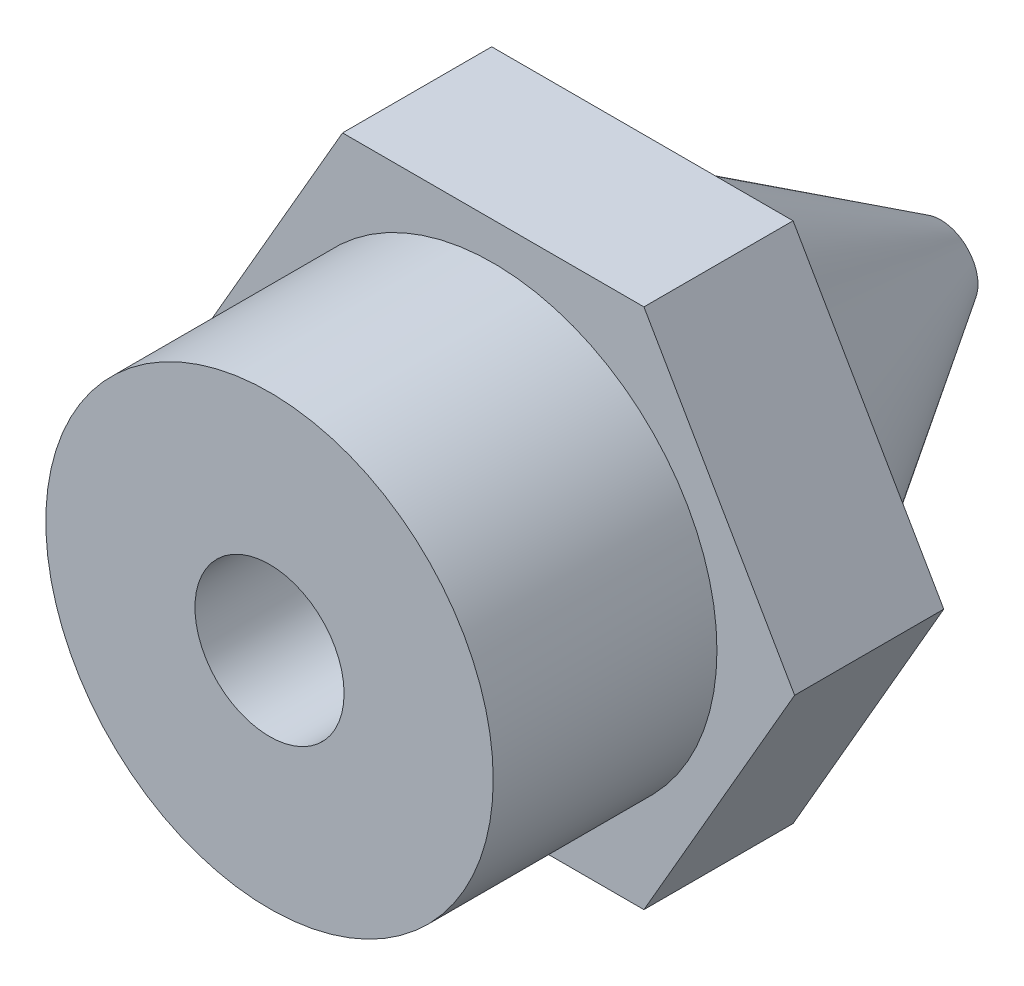
ISO-10303-21;
HEADER;
FILE_DESCRIPTION(('STEP AP214'),'2;1');
FILE_NAME('part.step','',(''),(''),'','','');
FILE_SCHEMA(('AUTOMOTIVE_DESIGN { 1 0 10303 214 1 1 1 1 }'));
ENDSEC;
DATA;
#1=APPLICATION_CONTEXT('core data for automotive mechanical design processes');
#2=APPLICATION_PROTOCOL_DEFINITION('international standard','automotive_design',2000,#1);
#3=PRODUCT_CONTEXT('',#1,'mechanical');
#4=PRODUCT('Part','Part','',(#3));
#5=PRODUCT_RELATED_PRODUCT_CATEGORY('part','',(#4));
#6=PRODUCT_DEFINITION_FORMATION('','',#4);
#7=PRODUCT_DEFINITION_CONTEXT('part definition',#1,'design');
#8=PRODUCT_DEFINITION('design','',#6,#7);
#9=PRODUCT_DEFINITION_SHAPE('','',#8);
#10=(LENGTH_UNIT() NAMED_UNIT(*) SI_UNIT(.MILLI.,.METRE.));
#11=(NAMED_UNIT(*) PLANE_ANGLE_UNIT() SI_UNIT($,.RADIAN.));
#12=(NAMED_UNIT(*) SI_UNIT($,.STERADIAN.) SOLID_ANGLE_UNIT());
#13=UNCERTAINTY_MEASURE_WITH_UNIT(LENGTH_MEASURE(1.E-05),#10,'distance_accuracy_value','');
#14=(GEOMETRIC_REPRESENTATION_CONTEXT(3) GLOBAL_UNCERTAINTY_ASSIGNED_CONTEXT((#13)) GLOBAL_UNIT_ASSIGNED_CONTEXT((#10,
#11,#12)) REPRESENTATION_CONTEXT('',''));
#15=CARTESIAN_POINT('',(0.,0.,0.));
#16=DIRECTION('',(0.,0.,1.));
#17=DIRECTION('',(1.,0.,0.));
#18=AXIS2_PLACEMENT_3D('',#15,#16,#17);
#19=CARTESIAN_POINT('',(2.02072594216368,3.50000000000001,9.));
#20=DIRECTION('',(0.,-1.,0.));
#21=DIRECTION('',(1.,0.,0.));
#22=AXIS2_PLACEMENT_3D('',#19,#20,#21);
#23=PLANE('',#22);
#24=DIRECTION('',(1.,0.,0.));
#25=VECTOR('',#24,1.);
#26=CARTESIAN_POINT('',(2.02072594216368,3.50000000000001,4.));
#27=LINE('',#26,#25);
#28=CARTESIAN_POINT('',(-2.02072594216371,3.49999999999999,4.));
#29=VERTEX_POINT('',#28);
#30=CARTESIAN_POINT('',(2.02072594216368,3.50000000000001,4.));
#31=VERTEX_POINT('',#30);
#32=EDGE_CURVE('E49',#29,#31,#27,.T.);
#33=ORIENTED_EDGE('',*,*,#32,.F.);
#34=DIRECTION('',(0.,0.,-1.));
#35=VECTOR('',#34,1.);
#36=CARTESIAN_POINT('',(-2.02072594216371,3.49999999999999,9.));
#37=LINE('',#36,#35);
#38=CARTESIAN_POINT('',(-2.02072594216371,3.49999999999999,6.));
#39=VERTEX_POINT('',#38);
#40=EDGE_CURVE('E117',#39,#29,#37,.T.);
#41=ORIENTED_EDGE('',*,*,#40,.F.);
#42=DIRECTION('',(-1.,0.,0.));
#43=VECTOR('',#42,1.);
#44=CARTESIAN_POINT('',(2.02072594216368,3.50000000000001,6.));
#45=LINE('',#44,#43);
#46=CARTESIAN_POINT('',(2.02072594216368,3.50000000000001,6.));
#47=VERTEX_POINT('',#46);
#48=EDGE_CURVE('E108',#47,#39,#45,.T.);
#49=ORIENTED_EDGE('',*,*,#48,.F.);
#50=DIRECTION('',(0.,0.,-1.));
#51=VECTOR('',#50,1.);
#52=CARTESIAN_POINT('',(2.02072594216368,3.50000000000001,9.));
#53=LINE('',#52,#51);
#54=EDGE_CURVE('E104',#47,#31,#53,.T.);
#55=ORIENTED_EDGE('',*,*,#54,.T.);
#56=EDGE_LOOP('',(#33,#41,#49,#55));
#57=FACE_BOUND('',#56,.T.);
#58=ADVANCED_FACE('F34',(#57),#23,.F.);
#59=CARTESIAN_POINT('',(-2.02072594216371,3.49999999999999,9.));
#60=DIRECTION('',(0.866025403784441,-0.499999999999995,0.));
#61=DIRECTION('',(0.499999999999995,0.866025403784442,0.));
#62=AXIS2_PLACEMENT_3D('',#59,#60,#61);
#63=PLANE('',#62);
#64=DIRECTION('',(0.499999999999995,0.866025403784442,0.));
#65=VECTOR('',#64,1.);
#66=CARTESIAN_POINT('',(-2.02072594216371,3.49999999999999,4.));
#67=LINE('',#66,#65);
#68=CARTESIAN_POINT('',(-4.04145188432738,0.,4.));
#69=VERTEX_POINT('',#68);
#70=EDGE_CURVE('E140',#69,#29,#67,.T.);
#71=ORIENTED_EDGE('',*,*,#70,.F.);
#72=DIRECTION('',(0.,0.,-1.));
#73=VECTOR('',#72,1.);
#74=CARTESIAN_POINT('',(-4.04145188432738,0.,9.));
#75=LINE('',#74,#73);
#76=CARTESIAN_POINT('',(-4.04145188432738,0.,6.));
#77=VERTEX_POINT('',#76);
#78=EDGE_CURVE('E114',#77,#69,#75,.T.);
#79=ORIENTED_EDGE('',*,*,#78,.F.);
#80=DIRECTION('',(-0.499999999999995,-0.866025403784442,0.));
#81=VECTOR('',#80,1.);
#82=CARTESIAN_POINT('',(-2.02072594216371,3.49999999999999,6.));
#83=LINE('',#82,#81);
#84=EDGE_CURVE('E125',#39,#77,#83,.T.);
#85=ORIENTED_EDGE('',*,*,#84,.F.);
#86=ORIENTED_EDGE('',*,*,#40,.T.);
#87=EDGE_LOOP('',(#71,#79,#85,#86));
#88=FACE_BOUND('',#87,.T.);
#89=ADVANCED_FACE('F177',(#88),#63,.F.);
#90=CARTESIAN_POINT('',(-4.04145188432738,0.,9.));
#91=DIRECTION('',(0.866025403784434,0.500000000000007,0.));
#92=DIRECTION('',(-0.500000000000007,0.866025403784435,0.));
#93=AXIS2_PLACEMENT_3D('',#90,#91,#92);
#94=PLANE('',#93);
#95=DIRECTION('',(-0.500000000000007,0.866025403784435,0.));
#96=VECTOR('',#95,1.);
#97=CARTESIAN_POINT('',(-4.04145188432738,0.,4.));
#98=LINE('',#97,#96);
#99=CARTESIAN_POINT('',(-2.02072594216366,-3.50000000000002,4.));
#100=VERTEX_POINT('',#99);
#101=EDGE_CURVE('E142',#100,#69,#98,.T.);
#102=ORIENTED_EDGE('',*,*,#101,.F.);
#103=DIRECTION('',(0.,0.,-1.));
#104=VECTOR('',#103,1.);
#105=CARTESIAN_POINT('',(-2.02072594216366,-3.50000000000002,9.));
#106=LINE('',#105,#104);
#107=CARTESIAN_POINT('',(-2.02072594216366,-3.50000000000002,6.));
#108=VERTEX_POINT('',#107);
#109=EDGE_CURVE('E106',#108,#100,#106,.T.);
#110=ORIENTED_EDGE('',*,*,#109,.F.);
#111=DIRECTION('',(0.500000000000007,-0.866025403784435,0.));
#112=VECTOR('',#111,1.);
#113=CARTESIAN_POINT('',(-4.04145188432738,0.,6.));
#114=LINE('',#113,#112);
#115=EDGE_CURVE('E126',#77,#108,#114,.T.);
#116=ORIENTED_EDGE('',*,*,#115,.F.);
#117=ORIENTED_EDGE('',*,*,#78,.T.);
#118=EDGE_LOOP('',(#102,#110,#116,#117));
#119=FACE_BOUND('',#118,.T.);
#120=ADVANCED_FACE('F181',(#119),#94,.F.);
#121=CARTESIAN_POINT('',(-2.02072594216366,-3.50000000000002,9.));
#122=DIRECTION('',(0.,1.,0.));
#123=DIRECTION('',(-1.,0.,0.));
#124=AXIS2_PLACEMENT_3D('',#121,#122,#123);
#125=PLANE('',#124);
#126=DIRECTION('',(-1.,0.,0.));
#127=VECTOR('',#126,1.);
#128=CARTESIAN_POINT('',(-2.02072594216366,-3.50000000000002,4.));
#129=LINE('',#128,#127);
#130=CARTESIAN_POINT('',(2.02072594216373,-3.49999999999998,4.));
#131=VERTEX_POINT('',#130);
#132=EDGE_CURVE('E100',#131,#100,#129,.T.);
#133=ORIENTED_EDGE('',*,*,#132,.F.);
#134=DIRECTION('',(0.,0.,-1.));
#135=VECTOR('',#134,1.);
#136=CARTESIAN_POINT('',(2.02072594216373,-3.49999999999998,9.));
#137=LINE('',#136,#135);
#138=CARTESIAN_POINT('',(2.02072594216373,-3.49999999999998,6.));
#139=VERTEX_POINT('',#138);
#140=EDGE_CURVE('E99',#139,#131,#137,.T.);
#141=ORIENTED_EDGE('',*,*,#140,.F.);
#142=DIRECTION('',(1.,0.,0.));
#143=VECTOR('',#142,1.);
#144=CARTESIAN_POINT('',(-2.02072594216366,-3.50000000000002,6.));
#145=LINE('',#144,#143);
#146=EDGE_CURVE('E130',#108,#139,#145,.T.);
#147=ORIENTED_EDGE('',*,*,#146,.F.);
#148=ORIENTED_EDGE('',*,*,#109,.T.);
#149=EDGE_LOOP('',(#133,#141,#147,#148));
#150=FACE_BOUND('',#149,.T.);
#151=ADVANCED_FACE('F187',(#150),#125,.F.);
#152=CARTESIAN_POINT('',(2.02072594216373,-3.49999999999998,9.));
#153=DIRECTION('',(-0.866025403784442,0.499999999999995,0.));
#154=DIRECTION('',(-0.499999999999995,-0.866025403784442,0.));
#155=AXIS2_PLACEMENT_3D('',#152,#153,#154);
#156=PLANE('',#155);
#157=DIRECTION('',(-0.499999999999995,-0.866025403784442,0.));
#158=VECTOR('',#157,1.);
#159=CARTESIAN_POINT('',(2.02072594216373,-3.49999999999998,4.));
#160=LINE('',#159,#158);
#161=CARTESIAN_POINT('',(4.04145188432738,0.,4.));
#162=VERTEX_POINT('',#161);
#163=EDGE_CURVE('E86',#162,#131,#160,.T.);
#164=ORIENTED_EDGE('',*,*,#163,.F.);
#165=DIRECTION('',(0.,0.,-1.));
#166=VECTOR('',#165,1.);
#167=CARTESIAN_POINT('',(4.04145188432738,0.,9.));
#168=LINE('',#167,#166);
#169=CARTESIAN_POINT('',(4.04145188432738,0.,6.));
#170=VERTEX_POINT('',#169);
#171=EDGE_CURVE('E97',#170,#162,#168,.T.);
#172=ORIENTED_EDGE('',*,*,#171,.F.);
#173=DIRECTION('',(0.499999999999995,0.866025403784442,0.));
#174=VECTOR('',#173,1.);
#175=CARTESIAN_POINT('',(2.02072594216373,-3.49999999999998,6.));
#176=LINE('',#175,#174);
#177=EDGE_CURVE('E57',#139,#170,#176,.T.);
#178=ORIENTED_EDGE('',*,*,#177,.F.);
#179=ORIENTED_EDGE('',*,*,#140,.T.);
#180=EDGE_LOOP('',(#164,#172,#178,#179));
#181=FACE_BOUND('',#180,.T.);
#182=ADVANCED_FACE('F96',(#181),#156,.F.);
#183=CARTESIAN_POINT('',(4.04145188432738,0.,9.));
#184=DIRECTION('',(-0.866025403784438,-0.500000000000001,0.));
#185=DIRECTION('',(0.500000000000001,-0.866025403784438,0.));
#186=AXIS2_PLACEMENT_3D('',#183,#184,#185);
#187=PLANE('',#186);
#188=DIRECTION('',(0.500000000000001,-0.866025403784438,0.));
#189=VECTOR('',#188,1.);
#190=CARTESIAN_POINT('',(4.04145188432738,0.,4.));
#191=LINE('',#190,#189);
#192=EDGE_CURVE('E42',#31,#162,#191,.T.);
#193=ORIENTED_EDGE('',*,*,#192,.F.);
#194=ORIENTED_EDGE('',*,*,#54,.F.);
#195=DIRECTION('',(-0.500000000000001,0.866025403784438,0.));
#196=VECTOR('',#195,1.);
#197=CARTESIAN_POINT('',(4.04145188432738,0.,6.));
#198=LINE('',#197,#196);
#199=EDGE_CURVE('E92',#170,#47,#198,.T.);
#200=ORIENTED_EDGE('',*,*,#199,.F.);
#201=ORIENTED_EDGE('',*,*,#171,.T.);
#202=EDGE_LOOP('',(#193,#194,#200,#201));
#203=FACE_BOUND('',#202,.T.);
#204=ADVANCED_FACE('F103',(#203),#187,.F.);
#205=CARTESIAN_POINT('',(0.,0.,6.));
#206=DIRECTION('',(0.,0.,1.));
#207=DIRECTION('',(1.,0.,0.));
#208=AXIS2_PLACEMENT_3D('',#205,#206,#207);
#209=PLANE('',#208);
#210=CARTESIAN_POINT('',(0.,0.,6.));
#211=DIRECTION('',(0.,0.,1.));
#212=DIRECTION('',(1.,0.,0.));
#213=AXIS2_PLACEMENT_3D('',#210,#211,#212);
#214=CIRCLE('',#213,3.);
#215=CARTESIAN_POINT('',(3.,0.,6.));
#216=VERTEX_POINT('',#215);
#217=EDGE_CURVE('E133',#216,#216,#214,.T.);
#218=ORIENTED_EDGE('',*,*,#217,.F.);
#219=EDGE_LOOP('',(#218));
#220=FACE_BOUND('',#219,.T.);
#221=ORIENTED_EDGE('',*,*,#48,.T.);
#222=ORIENTED_EDGE('',*,*,#84,.T.);
#223=ORIENTED_EDGE('',*,*,#115,.T.);
#224=ORIENTED_EDGE('',*,*,#146,.T.);
#225=ORIENTED_EDGE('',*,*,#177,.T.);
#226=ORIENTED_EDGE('',*,*,#199,.T.);
#227=EDGE_LOOP('',(#221,#222,#223,#224,#225,#226));
#228=FACE_BOUND('',#227,.T.);
#229=ADVANCED_FACE('F121',(#220,#228),#209,.T.);
#230=CARTESIAN_POINT('',(0.,0.,6.));
#231=DIRECTION('',(0.,0.,1.));
#232=DIRECTION('',(1.,0.,0.));
#233=AXIS2_PLACEMENT_3D('',#230,#231,#232);
#234=CYLINDRICAL_SURFACE('',#233,3.);
#235=ORIENTED_EDGE('',*,*,#217,.T.);
#236=EDGE_LOOP('',(#235));
#237=FACE_BOUND('',#236,.T.);
#238=CARTESIAN_POINT('',(0.,0.,9.));
#239=DIRECTION('',(0.,0.,1.));
#240=DIRECTION('',(1.,0.,0.));
#241=AXIS2_PLACEMENT_3D('',#238,#239,#240);
#242=CIRCLE('',#241,3.);
#243=CARTESIAN_POINT('',(3.,0.,9.));
#244=VERTEX_POINT('',#243);
#245=EDGE_CURVE('E134',#244,#244,#242,.T.);
#246=ORIENTED_EDGE('',*,*,#245,.F.);
#247=EDGE_LOOP('',(#246));
#248=FACE_BOUND('',#247,.T.);
#249=ADVANCED_FACE('F162',(#237,#248),#234,.T.);
#250=CARTESIAN_POINT('',(0.,0.,9.));
#251=DIRECTION('',(0.,0.,1.));
#252=DIRECTION('',(1.,0.,0.));
#253=AXIS2_PLACEMENT_3D('',#250,#251,#252);
#254=PLANE('',#253);
#255=CARTESIAN_POINT('',(0.,0.,9.));
#256=DIRECTION('',(0.,0.,1.));
#257=DIRECTION('',(1.,0.,0.));
#258=AXIS2_PLACEMENT_3D('',#255,#256,#257);
#259=CIRCLE('',#258,1.);
#260=CARTESIAN_POINT('',(1.,0.,9.));
#261=VERTEX_POINT('',#260);
#262=EDGE_CURVE('E153',#261,#261,#259,.T.);
#263=ORIENTED_EDGE('',*,*,#262,.F.);
#264=EDGE_LOOP('',(#263));
#265=FACE_BOUND('',#264,.T.);
#266=ORIENTED_EDGE('',*,*,#245,.T.);
#267=EDGE_LOOP('',(#266));
#268=FACE_BOUND('',#267,.T.);
#269=ADVANCED_FACE('F159',(#265,#268),#254,.T.);
#270=CARTESIAN_POINT('',(0.,0.,4.));
#271=DIRECTION('',(0.,0.,-1.));
#272=DIRECTION('',(-1.,0.,0.));
#273=AXIS2_PLACEMENT_3D('',#270,#271,#272);
#274=PLANE('',#273);
#275=CARTESIAN_POINT('',(0.,0.,4.));
#276=DIRECTION('',(0.,0.,-1.));
#277=DIRECTION('',(-1.,0.,0.));
#278=AXIS2_PLACEMENT_3D('',#275,#276,#277);
#279=CIRCLE('',#278,3.);
#280=CARTESIAN_POINT('',(2.99999999999998,0.,4.));
#281=VERTEX_POINT('',#280);
#282=EDGE_CURVE('E101',#281,#281,#279,.T.);
#283=ORIENTED_EDGE('',*,*,#282,.F.);
#284=EDGE_LOOP('',(#283));
#285=FACE_BOUND('',#284,.T.);
#286=ORIENTED_EDGE('',*,*,#32,.T.);
#287=ORIENTED_EDGE('',*,*,#192,.T.);
#288=ORIENTED_EDGE('',*,*,#163,.T.);
#289=ORIENTED_EDGE('',*,*,#132,.T.);
#290=ORIENTED_EDGE('',*,*,#101,.T.);
#291=ORIENTED_EDGE('',*,*,#70,.T.);
#292=EDGE_LOOP('',(#286,#287,#288,#289,#290,#291));
#293=FACE_BOUND('',#292,.T.);
#294=ADVANCED_FACE('F85',(#285,#293),#274,.T.);
#295=CARTESIAN_POINT('',(0.,0.,0.));
#296=DIRECTION('',(0.,0.,1.));
#297=DIRECTION('',(1.,0.,0.));
#298=AXIS2_PLACEMENT_3D('',#295,#296,#297);
#299=PLANE('',#298);
#300=CARTESIAN_POINT('',(0.,0.,0.));
#301=DIRECTION('',(0.,0.,1.));
#302=DIRECTION('',(1.,0.,0.));
#303=AXIS2_PLACEMENT_3D('',#300,#301,#302);
#304=CIRCLE('',#303,0.150000000000001);
#305=CARTESIAN_POINT('',(0.15,0.,0.));
#306=VERTEX_POINT('',#305);
#307=EDGE_CURVE('E147',#306,#306,#304,.T.);
#308=ORIENTED_EDGE('',*,*,#307,.T.);
#309=EDGE_LOOP('',(#308));
#310=FACE_BOUND('',#309,.T.);
#311=CARTESIAN_POINT('',(0.,0.,0.));
#312=DIRECTION('',(0.,0.,1.));
#313=DIRECTION('',(1.,0.,0.));
#314=AXIS2_PLACEMENT_3D('',#311,#312,#313);
#315=CIRCLE('',#314,0.500522592362688);
#316=CARTESIAN_POINT('',(0.500522592362688,0.,0.));
#317=VERTEX_POINT('',#316);
#318=EDGE_CURVE('E11',#317,#317,#315,.F.);
#319=ORIENTED_EDGE('',*,*,#318,.T.);
#320=EDGE_LOOP('',(#319));
#321=FACE_BOUND('',#320,.T.);
#322=ADVANCED_FACE('F196',(#310,#321),#299,.F.);
#323=CARTESIAN_POINT('',(0.,0.,0.));
#324=DIRECTION('',(0.,0.,1.));
#325=DIRECTION('',(1.,0.,0.));
#326=AXIS2_PLACEMENT_3D('',#323,#324,#325);
#327=CONICAL_SURFACE('',#326,0.500522592362688,0.558505360638183);
#328=CARTESIAN_POINT('',(2.99999999999998,0.,4.));
#329=CARTESIAN_POINT('',(2.97396377700376,0.,3.95833333333333));
#330=CARTESIAN_POINT('',(2.94792755400754,0.,3.91666666666667));
#331=CARTESIAN_POINT('',(2.8958551080151,0.,3.83333333333333));
#332=CARTESIAN_POINT('',(2.86981888501887,0.,3.79166666666667));
#333=CARTESIAN_POINT('',(2.81774643902643,0.,3.70833333333333));
#334=CARTESIAN_POINT('',(2.79171021603021,0.,3.66666666666667));
#335=CARTESIAN_POINT('',(2.73963777003777,0.,3.58333333333333));
#336=CARTESIAN_POINT('',(2.71360154704154,0.,3.54166666666667));
#337=CARTESIAN_POINT('',(2.6615291010491,0.,3.45833333333333));
#338=CARTESIAN_POINT('',(2.63549287805288,0.,3.41666666666667));
#339=CARTESIAN_POINT('',(2.58342043206043,0.,3.33333333333333));
#340=CARTESIAN_POINT('',(2.55738420906421,0.,3.29166666666667));
#341=CARTESIAN_POINT('',(2.50531176307177,0.,3.20833333333333));
#342=CARTESIAN_POINT('',(2.47927554007555,0.,3.16666666666667));
#343=CARTESIAN_POINT('',(2.4272030940831,0.,3.08333333333333));
#344=CARTESIAN_POINT('',(2.40116687108688,0.,3.04166666666667));
#345=CARTESIAN_POINT('',(2.34909442509444,0.,2.95833333333333));
#346=CARTESIAN_POINT('',(2.32305820209822,0.,2.91666666666667));
#347=CARTESIAN_POINT('',(2.27098575610577,0.,2.83333333333333));
#348=CARTESIAN_POINT('',(2.24494953310955,0.,2.79166666666667));
#349=CARTESIAN_POINT('',(2.19287708711711,0.,2.70833333333333));
#350=CARTESIAN_POINT('',(2.16684086412088,0.,2.66666666666667));
#351=CARTESIAN_POINT('',(2.11476841812844,0.,2.58333333333333));
#352=CARTESIAN_POINT('',(2.08873219513222,0.,2.54166666666667));
#353=CARTESIAN_POINT('',(2.03665974913978,0.,2.45833333333333));
#354=CARTESIAN_POINT('',(2.01062352614355,0.,2.41666666666667));
#355=CARTESIAN_POINT('',(1.95855108015111,0.,2.33333333333333));
#356=CARTESIAN_POINT('',(1.93251485715489,0.,2.29166666666667));
#357=CARTESIAN_POINT('',(1.88044241116245,0.,2.20833333333333));
#358=CARTESIAN_POINT('',(1.85440618816622,0.,2.16666666666667));
#359=CARTESIAN_POINT('',(1.80233374217378,0.,2.08333333333333));
#360=CARTESIAN_POINT('',(1.77629751917756,0.,2.04166666666667));
#361=CARTESIAN_POINT('',(1.72422507318511,0.,1.95833333333333));
#362=CARTESIAN_POINT('',(1.69818885018889,0.,1.91666666666667));
#363=CARTESIAN_POINT('',(1.64611640419645,0.,1.83333333333333));
#364=CARTESIAN_POINT('',(1.62008018120023,0.,1.79166666666667));
#365=CARTESIAN_POINT('',(1.56800773520778,0.,1.70833333333333));
#366=CARTESIAN_POINT('',(1.54197151221156,0.,1.66666666666667));
#367=CARTESIAN_POINT('',(1.48989906621912,0.,1.58333333333333));
#368=CARTESIAN_POINT('',(1.4638628432229,0.,1.54166666666667));
#369=CARTESIAN_POINT('',(1.41179039723045,0.,1.45833333333333));
#370=CARTESIAN_POINT('',(1.38575417423423,0.,1.41666666666667));
#371=CARTESIAN_POINT('',(1.33368172824179,0.,1.33333333333333));
#372=CARTESIAN_POINT('',(1.30764550524556,0.,1.29166666666667));
#373=CARTESIAN_POINT('',(1.25557305925312,0.,1.20833333333333));
#374=CARTESIAN_POINT('',(1.2295368362569,0.,1.16666666666667));
#375=CARTESIAN_POINT('',(1.17746439026446,0.,1.08333333333333));
#376=CARTESIAN_POINT('',(1.15142816726823,0.,1.04166666666667));
#377=CARTESIAN_POINT('',(1.09935572127579,0.,0.958333333333333));
#378=CARTESIAN_POINT('',(1.07331949827957,0.,0.916666666666667));
#379=CARTESIAN_POINT('',(1.02124705228712,0.,0.833333333333333));
#380=CARTESIAN_POINT('',(0.995210829290903,0.,0.791666666666667));
#381=CARTESIAN_POINT('',(0.943138383298459,0.,0.708333333333333));
#382=CARTESIAN_POINT('',(0.917102160302237,0.,0.666666666666667));
#383=CARTESIAN_POINT('',(0.865029714309794,0.,0.583333333333333));
#384=CARTESIAN_POINT('',(0.838993491313572,0.,0.541666666666667));
#385=CARTESIAN_POINT('',(0.786921045321128,0.,0.458333333333333));
#386=CARTESIAN_POINT('',(0.760884822324907,0.,0.416666666666667));
#387=CARTESIAN_POINT('',(0.708812376332463,0.,0.333333333333333));
#388=CARTESIAN_POINT('',(0.682776153336241,0.,0.291666666666667));
#389=CARTESIAN_POINT('',(0.630703707343798,0.,0.208333333333333));
#390=CARTESIAN_POINT('',(0.604667484347576,0.,0.166666666666667));
#391=CARTESIAN_POINT('',(0.552595038355132,0.,0.0833333333333335));
#392=CARTESIAN_POINT('',(0.52655881535891,0.,0.0416666666666668));
#393=CARTESIAN_POINT('',(0.500522592362688,0.,0.));
#394=B_SPLINE_CURVE_WITH_KNOTS('',3,(#328,#329,#330,#331,#332,#333,#334,#335,#336,#337,#338,
#339,#340,#341,#342,#343,#344,#345,#346,#347,#348,#349,#350,#351,#352,#353,#354,#355,#356,#357,
#358,#359,#360,#361,#362,#363,#364,#365,#366,#367,#368,#369,#370,#371,#372,#373,#374,#375,#376,
#377,#378,#379,#380,#381,#382,#383,#384,#385,#386,#387,#388,#389,#390,#391,#392,#393),
.UNSPECIFIED.,.F.,.F.,(4,2,2,2,2,2,2,2,2,2,2,2,2,2,2,2,2,2,2,2,2,2,2,2,2,2,2,2,2,2,2,2,4),(0.,
0.147397300420262,0.294794600840524,0.442191901260785,0.589589201681047,0.736986502101309,
0.884383802521571,1.03178110294183,1.17917840336209,1.32657570378236,1.47397300420262,
1.62137030462288,1.76876760504314,1.9161649054634,2.06356220588366,2.21095950630393,
2.35835680672419,2.50575410714445,2.65315140756471,2.80054870798497,2.94794600840524,
3.0953433088255,3.24274060924576,3.39013790966602,3.53753521008628,3.68493251050655,
3.83232981092681,3.97972711134707,4.12712441176733,4.27452171218759,4.42191901260786,
4.56931631302812,4.71671361344838),.UNSPECIFIED.);
#395=EDGE_CURVE('BSEAM36',#281,#317,#394,.T.);
#396=ORIENTED_EDGE('',*,*,#282,.T.);
#397=ORIENTED_EDGE('',*,*,#318,.F.);
#398=ORIENTED_EDGE('',*,*,#395,.T.);
#399=ORIENTED_EDGE('',*,*,#395,.F.);
#400=EDGE_LOOP('',(#396,#398,#397,#399));
#401=FACE_BOUND('',#400,.T.);
#402=ADVANCED_FACE('F36',(#401),#327,.T.);
#403=CARTESIAN_POINT('',(0.,0.,6.92269446377879));
#404=DIRECTION('',(0.,0.,1.));
#405=DIRECTION('',(1.,0.,0.));
#406=AXIS2_PLACEMENT_3D('',#403,#404,#405);
#407=CONICAL_SURFACE('',#406,1.,0.122173047639596);
#408=CARTESIAN_POINT('',(0.,0.,6.92269446377879));
#409=DIRECTION('',(0.,0.,1.));
#410=DIRECTION('',(1.,0.,0.));
#411=AXIS2_PLACEMENT_3D('',#408,#409,#410);
#412=CIRCLE('',#411,1.);
#413=CARTESIAN_POINT('',(1.,0.,6.92269446377879));
#414=VERTEX_POINT('',#413);
#415=EDGE_CURVE('E150',#414,#414,#412,.T.);
#416=CARTESIAN_POINT('',(0.15,0.,0.));
#417=CARTESIAN_POINT('',(0.158854166666667,0.,0.0721114006643616));
#418=CARTESIAN_POINT('',(0.167708333333333,0.,0.144222801328724));
#419=CARTESIAN_POINT('',(0.185416666666667,0.,0.288445602657449));
#420=CARTESIAN_POINT('',(0.194270833333333,0.,0.360557003321811));
#421=CARTESIAN_POINT('',(0.211979166666667,0.,0.504779804650536));
#422=CARTESIAN_POINT('',(0.220833333333333,0.,0.576891205314898));
#423=CARTESIAN_POINT('',(0.238541666666667,0.,0.721114006643623));
#424=CARTESIAN_POINT('',(0.247395833333333,0.,0.793225407307985));
#425=CARTESIAN_POINT('',(0.265104166666667,0.,0.93744820863671));
#426=CARTESIAN_POINT('',(0.273958333333333,0.,1.00955960930107));
#427=CARTESIAN_POINT('',(0.291666666666667,0.,1.1537824106298));
#428=CARTESIAN_POINT('',(0.300520833333333,0.,1.22589381129416));
#429=CARTESIAN_POINT('',(0.318229166666667,0.,1.37011661262288));
#430=CARTESIAN_POINT('',(0.327083333333333,0.,1.44222801328725));
#431=CARTESIAN_POINT('',(0.344791666666667,0.,1.58645081461597));
#432=CARTESIAN_POINT('',(0.353645833333334,0.,1.65856221528033));
#433=CARTESIAN_POINT('',(0.371354166666667,0.,1.80278501660906));
#434=CARTESIAN_POINT('',(0.380208333333333,0.,1.87489641727342));
#435=CARTESIAN_POINT('',(0.397916666666667,0.,2.01911921860215));
#436=CARTESIAN_POINT('',(0.406770833333334,0.,2.09123061926651));
#437=CARTESIAN_POINT('',(0.424479166666667,0.,2.23545342059523));
#438=CARTESIAN_POINT('',(0.433333333333334,0.,2.3075648212596));
#439=CARTESIAN_POINT('',(0.451041666666667,0.,2.45178762258832));
#440=CARTESIAN_POINT('',(0.459895833333334,0.,2.52389902325268));
#441=CARTESIAN_POINT('',(0.477604166666667,0.,2.66812182458141));
#442=CARTESIAN_POINT('',(0.486458333333334,0.,2.74023322524577));
#443=CARTESIAN_POINT('',(0.504166666666667,0.,2.88445602657449));
#444=CARTESIAN_POINT('',(0.513020833333334,0.,2.95656742723886));
#445=CARTESIAN_POINT('',(0.530729166666667,0.,3.10079022856758));
#446=CARTESIAN_POINT('',(0.539583333333334,0.,3.17290162923194));
#447=CARTESIAN_POINT('',(0.557291666666667,0.,3.31712443056067));
#448=CARTESIAN_POINT('',(0.566145833333334,0.,3.38923583122503));
#449=CARTESIAN_POINT('',(0.583854166666667,0.,3.53345863255376));
#450=CARTESIAN_POINT('',(0.592708333333334,0.,3.60557003321812));
#451=CARTESIAN_POINT('',(0.610416666666667,0.,3.74979283454684));
#452=CARTESIAN_POINT('',(0.619270833333334,0.,3.82190423521121));
#453=CARTESIAN_POINT('',(0.636979166666667,0.,3.96612703653993));
#454=CARTESIAN_POINT('',(0.645833333333334,0.,4.03823843720429));
#455=CARTESIAN_POINT('',(0.663541666666667,0.,4.18246123853302));
#456=CARTESIAN_POINT('',(0.672395833333334,0.,4.25457263919738));
#457=CARTESIAN_POINT('',(0.690104166666667,0.,4.39879544052611));
#458=CARTESIAN_POINT('',(0.698958333333334,0.,4.47090684119047));
#459=CARTESIAN_POINT('',(0.716666666666667,0.,4.61512964251919));
#460=CARTESIAN_POINT('',(0.725520833333334,0.,4.68724104318355));
#461=CARTESIAN_POINT('',(0.743229166666667,0.,4.83146384451228));
#462=CARTESIAN_POINT('',(0.752083333333334,0.,4.90357524517664));
#463=CARTESIAN_POINT('',(0.769791666666667,0.,5.04779804650537));
#464=CARTESIAN_POINT('',(0.778645833333334,0.,5.11990944716973));
#465=CARTESIAN_POINT('',(0.796354166666667,0.,5.26413224849845));
#466=CARTESIAN_POINT('',(0.805208333333334,0.,5.33624364916282));
#467=CARTESIAN_POINT('',(0.822916666666667,0.,5.48046645049154));
#468=CARTESIAN_POINT('',(0.831770833333334,0.,5.5525778511559));
#469=CARTESIAN_POINT('',(0.849479166666667,0.,5.69680065248463));
#470=CARTESIAN_POINT('',(0.858333333333334,0.,5.76891205314899));
#471=CARTESIAN_POINT('',(0.876041666666667,0.,5.91313485447772));
#472=CARTESIAN_POINT('',(0.884895833333334,0.,5.98524625514208));
#473=CARTESIAN_POINT('',(0.902604166666667,0.,6.1294690564708));
#474=CARTESIAN_POINT('',(0.911458333333334,0.,6.20158045713517));
#475=CARTESIAN_POINT('',(0.929166666666667,0.,6.34580325846389));
#476=CARTESIAN_POINT('',(0.938020833333334,0.,6.41791465912825));
#477=CARTESIAN_POINT('',(0.955729166666668,0.,6.56213746045698));
#478=CARTESIAN_POINT('',(0.964583333333334,0.,6.63424886112134));
#479=CARTESIAN_POINT('',(0.982291666666668,0.,6.77847166245006));
#480=CARTESIAN_POINT('',(0.991145833333334,0.,6.85058306311443));
#481=CARTESIAN_POINT('',(1.,0.,6.92269446377879));
#482=B_SPLINE_CURVE_WITH_KNOTS('',3,(#416,#417,#418,#419,#420,#421,#422,#423,#424,#425,#426,
#427,#428,#429,#430,#431,#432,#433,#434,#435,#436,#437,#438,#439,#440,#441,#442,#443,#444,#445,
#446,#447,#448,#449,#450,#451,#452,#453,#454,#455,#456,#457,#458,#459,#460,#461,#462,#463,#464,
#465,#466,#467,#468,#469,#470,#471,#472,#473,#474,#475,#476,#477,#478,#479,#480,#481),
.UNSPECIFIED.,.F.,.F.,(4,2,2,2,2,2,2,2,2,2,2,2,2,2,2,2,2,2,2,2,2,2,2,2,2,2,2,2,2,2,2,2,4),(0.,
0.217958834090835,0.435917668181668,0.653876502272503,0.871835336363337,1.08979417045417,
1.30775300454501,1.52571183863584,1.74367067272667,1.96162950681751,2.17958834090834,
2.39754717499918,2.61550600909001,2.83346484318085,3.05142367727168,3.26938251136251,
3.48734134545335,3.70530017954418,3.92325901363502,4.14121784772585,4.35917668181668,
4.57713551590752,4.79509434999835,5.01305318408919,5.23101201818002,5.44897085227086,
5.66692968636169,5.88488852045252,6.10284735454336,6.32080618863419,6.53876502272503,
6.75672385681586,6.97468269090669),.UNSPECIFIED.);
#483=EDGE_CURVE('BSEAM203',#306,#414,#482,.T.);
#484=ORIENTED_EDGE('',*,*,#307,.F.);
#485=ORIENTED_EDGE('',*,*,#415,.T.);
#486=ORIENTED_EDGE('',*,*,#483,.T.);
#487=ORIENTED_EDGE('',*,*,#483,.F.);
#488=EDGE_LOOP('',(#484,#486,#485,#487));
#489=FACE_BOUND('',#488,.T.);
#490=ADVANCED_FACE('F203',(#489),#407,.F.);
#491=CARTESIAN_POINT('',(0.,0.,10.3816051571313));
#492=DIRECTION('',(0.,0.,1.));
#493=DIRECTION('',(1.,0.,0.));
#494=AXIS2_PLACEMENT_3D('',#491,#492,#493);
#495=CYLINDRICAL_SURFACE('',#494,1.);
#496=ORIENTED_EDGE('',*,*,#415,.F.);
#497=EDGE_LOOP('',(#496));
#498=FACE_BOUND('',#497,.T.);
#499=ORIENTED_EDGE('',*,*,#262,.T.);
#500=EDGE_LOOP('',(#499));
#501=FACE_BOUND('',#500,.T.);
#502=ADVANCED_FACE('F157',(#498,#501),#495,.F.);
#503=CLOSED_SHELL('',(#58,#89,#120,#151,#182,#204,#229,#249,#269,#294,#322,#402,#490,#502));
#504=MANIFOLD_SOLID_BREP('B2',#503);
#505=ADVANCED_BREP_SHAPE_REPRESENTATION('',(#18,#504),#14);
#506=SHAPE_DEFINITION_REPRESENTATION(#9,#505);
ENDSEC;
END-ISO-10303-21;
